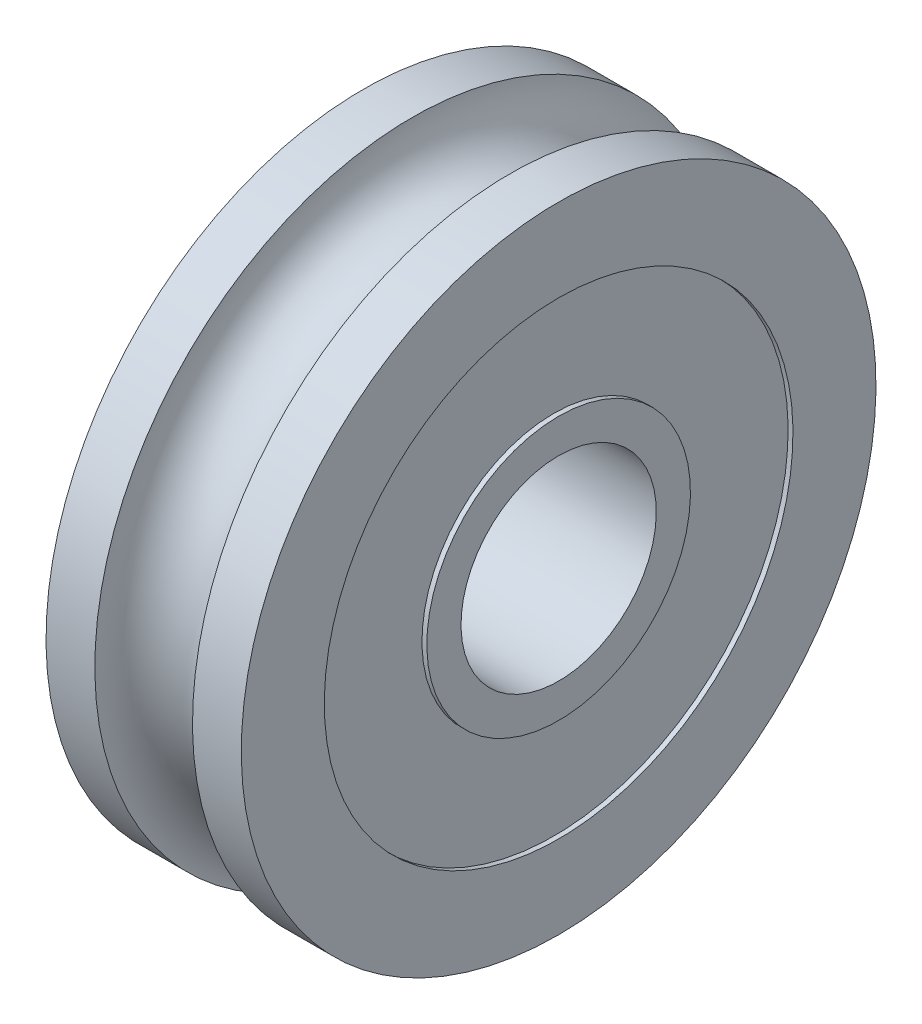
ISO-10303-21;
HEADER;
FILE_DESCRIPTION(('STEP AP214'),'2;1');
FILE_NAME('part.step','',(''),(''),'','','');
FILE_SCHEMA(('AUTOMOTIVE_DESIGN { 1 0 10303 214 1 1 1 1 }'));
ENDSEC;
DATA;
#1=APPLICATION_CONTEXT('core data for automotive mechanical design processes');
#2=APPLICATION_PROTOCOL_DEFINITION('international standard','automotive_design',2000,#1);
#3=PRODUCT_CONTEXT('',#1,'mechanical');
#4=PRODUCT('Part','Part','',(#3));
#5=PRODUCT_RELATED_PRODUCT_CATEGORY('part','',(#4));
#6=PRODUCT_DEFINITION_FORMATION('','',#4);
#7=PRODUCT_DEFINITION_CONTEXT('part definition',#1,'design');
#8=PRODUCT_DEFINITION('design','',#6,#7);
#9=PRODUCT_DEFINITION_SHAPE('','',#8);
#10=(LENGTH_UNIT() NAMED_UNIT(*) SI_UNIT(.MILLI.,.METRE.));
#11=(NAMED_UNIT(*) PLANE_ANGLE_UNIT() SI_UNIT($,.RADIAN.));
#12=(NAMED_UNIT(*) SI_UNIT($,.STERADIAN.) SOLID_ANGLE_UNIT());
#13=UNCERTAINTY_MEASURE_WITH_UNIT(LENGTH_MEASURE(1.E-05),#10,'distance_accuracy_value','');
#14=(GEOMETRIC_REPRESENTATION_CONTEXT(3) GLOBAL_UNCERTAINTY_ASSIGNED_CONTEXT((#13)) GLOBAL_UNIT_ASSIGNED_CONTEXT((#10,
#11,#12)) REPRESENTATION_CONTEXT('',''));
#15=CARTESIAN_POINT('',(0.,0.,0.));
#16=DIRECTION('',(0.,0.,1.));
#17=DIRECTION('',(1.,0.,0.));
#18=AXIS2_PLACEMENT_3D('',#15,#16,#17);
#19=CARTESIAN_POINT('',(-2.,6.5,0.));
#20=DIRECTION('',(1.,0.,0.));
#21=DIRECTION('',(0.,1.,0.));
#22=AXIS2_PLACEMENT_3D('',#19,#20,#21);
#23=PLANE('',#22);
#24=CARTESIAN_POINT('',(-2.00000000000001,0.,0.));
#25=DIRECTION('',(1.,0.,0.));
#26=DIRECTION('',(0.,1.,0.));
#27=AXIS2_PLACEMENT_3D('',#24,#25,#26);
#28=CIRCLE('',#27,2.);
#29=CARTESIAN_POINT('',(-2.00000000000001,2.,0.));
#30=VERTEX_POINT('',#29);
#31=EDGE_CURVE('E61',#30,#30,#28,.T.);
#32=ORIENTED_EDGE('',*,*,#31,.T.);
#33=EDGE_LOOP('',(#32));
#34=FACE_BOUND('',#33,.T.);
#35=CARTESIAN_POINT('',(-2.,0.,0.));
#36=DIRECTION('',(1.,0.,0.));
#37=DIRECTION('',(0.,1.,0.));
#38=AXIS2_PLACEMENT_3D('',#35,#36,#37);
#39=CIRCLE('',#38,2.7);
#40=CARTESIAN_POINT('',(-2.,2.7,0.));
#41=VERTEX_POINT('',#40);
#42=EDGE_CURVE('E86',#41,#41,#39,.T.);
#43=ORIENTED_EDGE('',*,*,#42,.F.);
#44=EDGE_LOOP('',(#43));
#45=FACE_BOUND('',#44,.T.);
#46=ADVANCED_FACE('F41',(#34,#45),#23,.F.);
#47=CARTESIAN_POINT('',(2.,6.5,0.));
#48=DIRECTION('',(-1.,0.,0.));
#49=DIRECTION('',(0.,-1.,0.));
#50=AXIS2_PLACEMENT_3D('',#47,#48,#49);
#51=PLANE('',#50);
#52=CARTESIAN_POINT('',(2.,0.,0.));
#53=DIRECTION('',(1.,0.,0.));
#54=DIRECTION('',(0.,1.,0.));
#55=AXIS2_PLACEMENT_3D('',#52,#53,#54);
#56=CIRCLE('',#55,2.);
#57=CARTESIAN_POINT('',(2.,2.,0.));
#58=VERTEX_POINT('',#57);
#59=EDGE_CURVE('E62',#58,#58,#56,.T.);
#60=ORIENTED_EDGE('',*,*,#59,.F.);
#61=EDGE_LOOP('',(#60));
#62=FACE_BOUND('',#61,.T.);
#63=CARTESIAN_POINT('',(2.,0.,0.));
#64=DIRECTION('',(1.,0.,0.));
#65=DIRECTION('',(0.,1.,0.));
#66=AXIS2_PLACEMENT_3D('',#63,#64,#65);
#67=CIRCLE('',#66,2.7);
#68=CARTESIAN_POINT('',(2.,2.7,0.));
#69=VERTEX_POINT('',#68);
#70=EDGE_CURVE('E74',#69,#69,#67,.T.);
#71=ORIENTED_EDGE('',*,*,#70,.T.);
#72=EDGE_LOOP('',(#71));
#73=FACE_BOUND('',#72,.T.);
#74=ADVANCED_FACE('F102',(#62,#73),#51,.F.);
#75=CARTESIAN_POINT('',(0.,0.,0.));
#76=DIRECTION('',(-1.,0.,0.));
#77=DIRECTION('',(0.,-1.,0.));
#78=AXIS2_PLACEMENT_3D('',#75,#76,#77);
#79=TOROIDAL_SURFACE('',#78,6.5,1.);
#80=CARTESIAN_POINT('',(-1.,0.,0.));
#81=DIRECTION('',(-1.,0.,0.));
#82=DIRECTION('',(0.,-1.,0.));
#83=AXIS2_PLACEMENT_3D('',#80,#81,#82);
#84=CIRCLE('',#83,6.5);
#85=CARTESIAN_POINT('',(-1.00000000000001,-6.5,0.));
#86=VERTEX_POINT('',#85);
#87=EDGE_CURVE('E10',#86,#86,#84,.T.);
#88=ORIENTED_EDGE('',*,*,#87,.F.);
#89=EDGE_LOOP('',(#88));
#90=FACE_BOUND('',#89,.T.);
#91=CARTESIAN_POINT('',(0.999999999999999,0.,0.));
#92=DIRECTION('',(-1.,0.,0.));
#93=DIRECTION('',(0.,-1.,0.));
#94=AXIS2_PLACEMENT_3D('',#91,#92,#93);
#95=CIRCLE('',#94,6.5);
#96=CARTESIAN_POINT('',(0.999999999999997,-6.5,0.));
#97=VERTEX_POINT('',#96);
#98=EDGE_CURVE('E56',#97,#97,#95,.T.);
#99=ORIENTED_EDGE('',*,*,#98,.T.);
#100=EDGE_LOOP('',(#99));
#101=FACE_BOUND('',#100,.T.);
#102=ADVANCED_FACE('F43',(#90,#101),#79,.F.);
#103=CARTESIAN_POINT('',(2.,0.,0.));
#104=DIRECTION('',(-1.,0.,0.));
#105=DIRECTION('',(0.,-1.,0.));
#106=AXIS2_PLACEMENT_3D('',#103,#104,#105);
#107=CYLINDRICAL_SURFACE('',#106,6.5);
#108=CARTESIAN_POINT('',(-2.,0.,0.));
#109=DIRECTION('',(-1.,0.,0.));
#110=DIRECTION('',(0.,-1.,0.));
#111=AXIS2_PLACEMENT_3D('',#108,#109,#110);
#112=CIRCLE('',#111,6.5);
#113=CARTESIAN_POINT('',(-2.00000000000001,-6.5,0.));
#114=VERTEX_POINT('',#113);
#115=EDGE_CURVE('E48',#114,#114,#112,.T.);
#116=ORIENTED_EDGE('',*,*,#115,.F.);
#117=EDGE_LOOP('',(#116));
#118=FACE_BOUND('',#117,.T.);
#119=ORIENTED_EDGE('',*,*,#87,.T.);
#120=EDGE_LOOP('',(#119));
#121=FACE_BOUND('',#120,.T.);
#122=ADVANCED_FACE('F114',(#118,#121),#107,.T.);
#123=CARTESIAN_POINT('',(-2.,0.,0.));
#124=DIRECTION('',(1.,0.,0.));
#125=DIRECTION('',(0.,1.,0.));
#126=AXIS2_PLACEMENT_3D('',#123,#124,#125);
#127=CIRCLE('',#126,4.8);
#128=CARTESIAN_POINT('',(-2.,4.8,0.));
#129=VERTEX_POINT('',#128);
#130=EDGE_CURVE('E80',#129,#129,#127,.T.);
#131=ORIENTED_EDGE('',*,*,#130,.T.);
#132=EDGE_LOOP('',(#131));
#133=FACE_BOUND('',#132,.T.);
#134=ORIENTED_EDGE('',*,*,#115,.T.);
#135=EDGE_LOOP('',(#134));
#136=FACE_BOUND('',#135,.T.);
#137=ADVANCED_FACE('F105',(#133,#136),#23,.F.);
#138=CARTESIAN_POINT('',(2.,0.,0.));
#139=DIRECTION('',(1.,0.,0.));
#140=DIRECTION('',(0.,1.,0.));
#141=AXIS2_PLACEMENT_3D('',#138,#139,#140);
#142=CIRCLE('',#141,4.8);
#143=CARTESIAN_POINT('',(2.,4.8,0.));
#144=VERTEX_POINT('',#143);
#145=EDGE_CURVE('E68',#144,#144,#142,.T.);
#146=ORIENTED_EDGE('',*,*,#145,.F.);
#147=EDGE_LOOP('',(#146));
#148=FACE_BOUND('',#147,.T.);
#149=CARTESIAN_POINT('',(2.,0.,0.));
#150=DIRECTION('',(-1.,0.,0.));
#151=DIRECTION('',(0.,-1.,0.));
#152=AXIS2_PLACEMENT_3D('',#149,#150,#151);
#153=CIRCLE('',#152,6.5);
#154=CARTESIAN_POINT('',(1.99999999999999,-6.5,0.));
#155=VERTEX_POINT('',#154);
#156=EDGE_CURVE('E52',#155,#155,#153,.T.);
#157=ORIENTED_EDGE('',*,*,#156,.F.);
#158=EDGE_LOOP('',(#157));
#159=FACE_BOUND('',#158,.T.);
#160=ADVANCED_FACE('F113',(#148,#159),#51,.F.);
#161=CARTESIAN_POINT('',(2.,0.,0.));
#162=DIRECTION('',(-1.,0.,0.));
#163=DIRECTION('',(0.,-1.,0.));
#164=AXIS2_PLACEMENT_3D('',#161,#162,#163);
#165=CYLINDRICAL_SURFACE('',#164,6.5);
#166=ORIENTED_EDGE('',*,*,#98,.F.);
#167=EDGE_LOOP('',(#166));
#168=FACE_BOUND('',#167,.T.);
#169=ORIENTED_EDGE('',*,*,#156,.T.);
#170=EDGE_LOOP('',(#169));
#171=FACE_BOUND('',#170,.T.);
#172=ADVANCED_FACE('F120',(#168,#171),#165,.T.);
#173=CARTESIAN_POINT('',(-2.00000000000001,0.,0.));
#174=DIRECTION('',(1.,0.,0.));
#175=DIRECTION('',(0.,1.,0.));
#176=AXIS2_PLACEMENT_3D('',#173,#174,#175);
#177=CYLINDRICAL_SURFACE('',#176,2.);
#178=ORIENTED_EDGE('',*,*,#31,.F.);
#179=EDGE_LOOP('',(#178));
#180=FACE_BOUND('',#179,.T.);
#181=ORIENTED_EDGE('',*,*,#59,.T.);
#182=EDGE_LOOP('',(#181));
#183=FACE_BOUND('',#182,.T.);
#184=ADVANCED_FACE('F146',(#180,#183),#177,.F.);
#185=CARTESIAN_POINT('',(1.9,0.,0.));
#186=DIRECTION('',(1.,0.,0.));
#187=DIRECTION('',(0.,1.,0.));
#188=AXIS2_PLACEMENT_3D('',#185,#186,#187);
#189=CYLINDRICAL_SURFACE('',#188,4.8);
#190=CARTESIAN_POINT('',(1.9,0.,0.));
#191=DIRECTION('',(1.,0.,0.));
#192=DIRECTION('',(0.,1.,0.));
#193=AXIS2_PLACEMENT_3D('',#190,#191,#192);
#194=CIRCLE('',#193,4.8);
#195=CARTESIAN_POINT('',(1.9,4.8,0.));
#196=VERTEX_POINT('',#195);
#197=EDGE_CURVE('E65',#196,#196,#194,.T.);
#198=ORIENTED_EDGE('',*,*,#197,.F.);
#199=EDGE_LOOP('',(#198));
#200=FACE_BOUND('',#199,.T.);
#201=ORIENTED_EDGE('',*,*,#145,.T.);
#202=EDGE_LOOP('',(#201));
#203=FACE_BOUND('',#202,.T.);
#204=ADVANCED_FACE('F142',(#200,#203),#189,.F.);
#205=CARTESIAN_POINT('',(1.9,0.,0.));
#206=DIRECTION('',(1.,0.,0.));
#207=DIRECTION('',(0.,1.,0.));
#208=AXIS2_PLACEMENT_3D('',#205,#206,#207);
#209=PLANE('',#208);
#210=CARTESIAN_POINT('',(1.9,0.,0.));
#211=DIRECTION('',(1.,0.,0.));
#212=DIRECTION('',(0.,1.,0.));
#213=AXIS2_PLACEMENT_3D('',#210,#211,#212);
#214=CIRCLE('',#213,2.7);
#215=CARTESIAN_POINT('',(1.9,2.7,0.));
#216=VERTEX_POINT('',#215);
#217=EDGE_CURVE('E71',#216,#216,#214,.T.);
#218=ORIENTED_EDGE('',*,*,#217,.F.);
#219=EDGE_LOOP('',(#218));
#220=FACE_BOUND('',#219,.T.);
#221=ORIENTED_EDGE('',*,*,#197,.T.);
#222=EDGE_LOOP('',(#221));
#223=FACE_BOUND('',#222,.T.);
#224=ADVANCED_FACE('F138',(#220,#223),#209,.T.);
#225=CARTESIAN_POINT('',(1.9,0.,0.));
#226=DIRECTION('',(1.,0.,0.));
#227=DIRECTION('',(0.,1.,0.));
#228=AXIS2_PLACEMENT_3D('',#225,#226,#227);
#229=CYLINDRICAL_SURFACE('',#228,2.7);
#230=ORIENTED_EDGE('',*,*,#217,.T.);
#231=EDGE_LOOP('',(#230));
#232=FACE_BOUND('',#231,.T.);
#233=ORIENTED_EDGE('',*,*,#70,.F.);
#234=EDGE_LOOP('',(#233));
#235=FACE_BOUND('',#234,.T.);
#236=ADVANCED_FACE('F132',(#232,#235),#229,.T.);
#237=CARTESIAN_POINT('',(-1.9,0.,0.));
#238=DIRECTION('',(-1.,0.,0.));
#239=DIRECTION('',(0.,1.,0.));
#240=AXIS2_PLACEMENT_3D('',#237,#238,#239);
#241=PLANE('',#240);
#242=CARTESIAN_POINT('',(-1.9,0.,0.));
#243=DIRECTION('',(1.,0.,0.));
#244=DIRECTION('',(0.,1.,0.));
#245=AXIS2_PLACEMENT_3D('',#242,#243,#244);
#246=CIRCLE('',#245,4.8);
#247=CARTESIAN_POINT('',(-1.9,4.8,0.));
#248=VERTEX_POINT('',#247);
#249=EDGE_CURVE('E77',#248,#248,#246,.T.);
#250=ORIENTED_EDGE('',*,*,#249,.F.);
#251=EDGE_LOOP('',(#250));
#252=FACE_BOUND('',#251,.T.);
#253=CARTESIAN_POINT('',(-1.9,0.,0.));
#254=DIRECTION('',(1.,0.,0.));
#255=DIRECTION('',(0.,1.,0.));
#256=AXIS2_PLACEMENT_3D('',#253,#254,#255);
#257=CIRCLE('',#256,2.7);
#258=CARTESIAN_POINT('',(-1.9,2.7,0.));
#259=VERTEX_POINT('',#258);
#260=EDGE_CURVE('E83',#259,#259,#257,.T.);
#261=ORIENTED_EDGE('',*,*,#260,.T.);
#262=EDGE_LOOP('',(#261));
#263=FACE_BOUND('',#262,.T.);
#264=ADVANCED_FACE('F92',(#252,#263),#241,.T.);
#265=CARTESIAN_POINT('',(-1.9,0.,0.));
#266=DIRECTION('',(-1.,0.,0.));
#267=DIRECTION('',(0.,-1.,0.));
#268=AXIS2_PLACEMENT_3D('',#265,#266,#267);
#269=CYLINDRICAL_SURFACE('',#268,4.8);
#270=ORIENTED_EDGE('',*,*,#249,.T.);
#271=EDGE_LOOP('',(#270));
#272=FACE_BOUND('',#271,.T.);
#273=ORIENTED_EDGE('',*,*,#130,.F.);
#274=EDGE_LOOP('',(#273));
#275=FACE_BOUND('',#274,.T.);
#276=ADVANCED_FACE('F97',(#272,#275),#269,.F.);
#277=CARTESIAN_POINT('',(-1.9,0.,0.));
#278=DIRECTION('',(-1.,0.,0.));
#279=DIRECTION('',(0.,-1.,0.));
#280=AXIS2_PLACEMENT_3D('',#277,#278,#279);
#281=CYLINDRICAL_SURFACE('',#280,2.7);
#282=ORIENTED_EDGE('',*,*,#260,.F.);
#283=EDGE_LOOP('',(#282));
#284=FACE_BOUND('',#283,.T.);
#285=ORIENTED_EDGE('',*,*,#42,.T.);
#286=EDGE_LOOP('',(#285));
#287=FACE_BOUND('',#286,.T.);
#288=ADVANCED_FACE('F94',(#284,#287),#281,.T.);
#289=CLOSED_SHELL('',(#46,#74,#102,#122,#137,#160,#172,#184,#204,#224,#236,#264,#276,#288));
#290=MANIFOLD_SOLID_BREP('B2',#289);
#291=ADVANCED_BREP_SHAPE_REPRESENTATION('',(#18,#290),#14);
#292=SHAPE_DEFINITION_REPRESENTATION(#9,#291);
ENDSEC;
END-ISO-10303-21;
